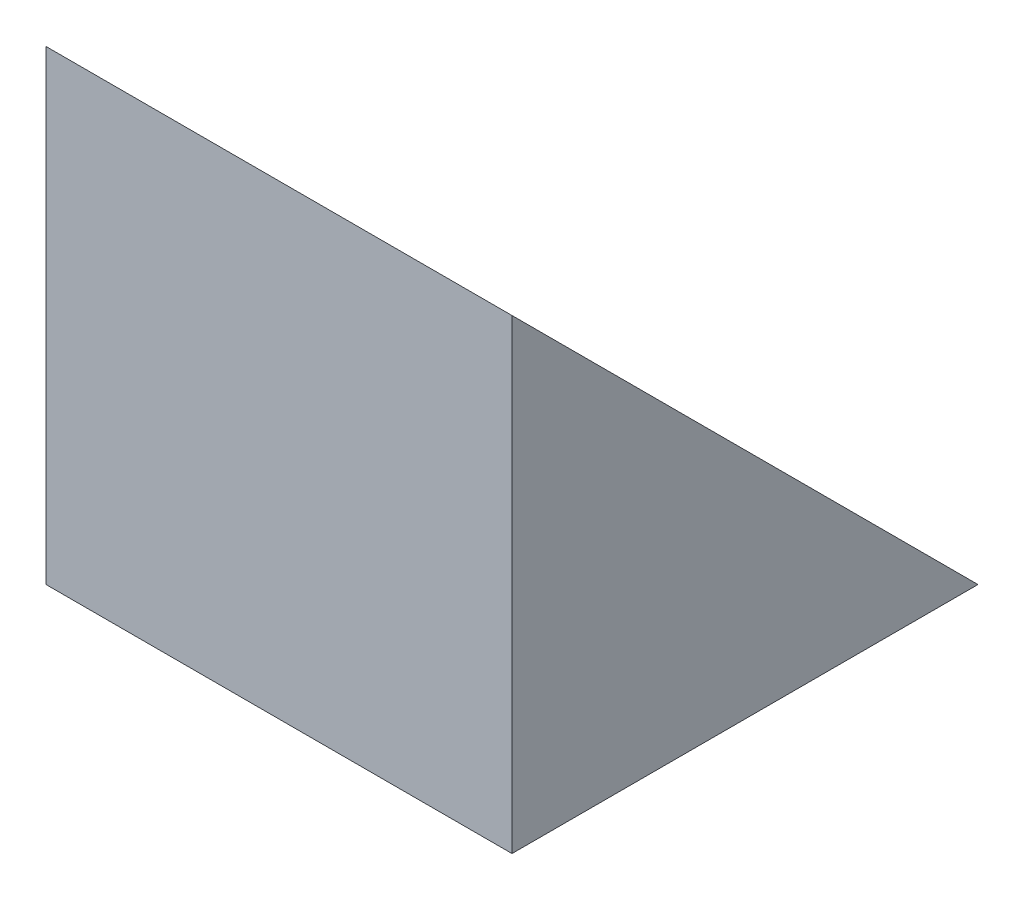
ISO-10303-21;
HEADER;
FILE_DESCRIPTION(('STEP AP214'),'2;1');
FILE_NAME('part.step','',(''),(''),'','','');
FILE_SCHEMA(('AUTOMOTIVE_DESIGN { 1 0 10303 214 1 1 1 1 }'));
ENDSEC;
DATA;
#1=APPLICATION_CONTEXT('core data for automotive mechanical design processes');
#2=APPLICATION_PROTOCOL_DEFINITION('international standard','automotive_design',2000,#1);
#3=PRODUCT_CONTEXT('',#1,'mechanical');
#4=PRODUCT('Part','Part','',(#3));
#5=PRODUCT_RELATED_PRODUCT_CATEGORY('part','',(#4));
#6=PRODUCT_DEFINITION_FORMATION('','',#4);
#7=PRODUCT_DEFINITION_CONTEXT('part definition',#1,'design');
#8=PRODUCT_DEFINITION('design','',#6,#7);
#9=PRODUCT_DEFINITION_SHAPE('','',#8);
#10=(LENGTH_UNIT() NAMED_UNIT(*) SI_UNIT(.MILLI.,.METRE.));
#11=(NAMED_UNIT(*) PLANE_ANGLE_UNIT() SI_UNIT($,.RADIAN.));
#12=(NAMED_UNIT(*) SI_UNIT($,.STERADIAN.) SOLID_ANGLE_UNIT());
#13=UNCERTAINTY_MEASURE_WITH_UNIT(LENGTH_MEASURE(1.E-05),#10,'distance_accuracy_value','');
#14=(GEOMETRIC_REPRESENTATION_CONTEXT(3) GLOBAL_UNCERTAINTY_ASSIGNED_CONTEXT((#13)) GLOBAL_UNIT_ASSIGNED_CONTEXT((#10,
#11,#12)) REPRESENTATION_CONTEXT('',''));
#15=CARTESIAN_POINT('',(0.,0.,0.));
#16=DIRECTION('',(0.,0.,1.));
#17=DIRECTION('',(1.,0.,0.));
#18=AXIS2_PLACEMENT_3D('',#15,#16,#17);
#19=CARTESIAN_POINT('',(40.,40.,0.));
#20=DIRECTION('',(0.,-0.707106781186548,0.707106781186548));
#21=DIRECTION('',(0.,-0.707106781186548,-0.707106781186548));
#22=AXIS2_PLACEMENT_3D('',#19,#20,#21);
#23=PLANE('',#22);
#24=DIRECTION('',(0.,0.707106781186548,0.707106781186548));
#25=VECTOR('',#24,1.);
#26=CARTESIAN_POINT('',(0.,40.,0.));
#27=LINE('',#26,#25);
#28=CARTESIAN_POINT('',(0.,0.,-40.));
#29=VERTEX_POINT('',#28);
#30=CARTESIAN_POINT('',(0.,40.,0.));
#31=VERTEX_POINT('',#30);
#32=EDGE_CURVE('E128',#29,#31,#27,.T.);
#33=ORIENTED_EDGE('',*,*,#32,.T.);
#34=DIRECTION('',(-1.,0.,0.));
#35=VECTOR('',#34,1.);
#36=CARTESIAN_POINT('',(40.,40.,0.));
#37=LINE('',#36,#35);
#38=CARTESIAN_POINT('',(40.,40.,0.));
#39=VERTEX_POINT('',#38);
#40=EDGE_CURVE('E147',#39,#31,#37,.T.);
#41=ORIENTED_EDGE('',*,*,#40,.F.);
#42=DIRECTION('',(0.,0.707106781186548,0.707106781186548));
#43=VECTOR('',#42,1.);
#44=CARTESIAN_POINT('',(40.,40.,0.));
#45=LINE('',#44,#43);
#46=CARTESIAN_POINT('',(40.,0.,-40.));
#47=VERTEX_POINT('',#46);
#48=EDGE_CURVE('E86',#47,#39,#45,.T.);
#49=ORIENTED_EDGE('',*,*,#48,.F.);
#50=DIRECTION('',(-1.,0.,0.));
#51=VECTOR('',#50,1.);
#52=CARTESIAN_POINT('',(40.,0.,-40.));
#53=LINE('',#52,#51);
#54=EDGE_CURVE('E150',#47,#29,#53,.T.);
#55=ORIENTED_EDGE('',*,*,#54,.T.);
#56=EDGE_LOOP('',(#33,#41,#49,#55));
#57=FACE_BOUND('',#56,.T.);
#58=DIRECTION('',(0.,0.707106781186548,0.707106781186548));
#59=VECTOR('',#58,1.);
#60=CARTESIAN_POINT('',(2.,40.,0.));
#61=LINE('',#60,#59);
#62=CARTESIAN_POINT('',(2.,2.,-38.));
#63=VERTEX_POINT('',#62);
#64=CARTESIAN_POINT('',(2.,36.,-4.));
#65=VERTEX_POINT('',#64);
#66=EDGE_CURVE('E11',#63,#65,#61,.T.);
#67=ORIENTED_EDGE('',*,*,#66,.F.);
#68=DIRECTION('',(-1.,0.,0.));
#69=VECTOR('',#68,1.);
#70=CARTESIAN_POINT('',(40.,2.,-38.));
#71=LINE('',#70,#69);
#72=CARTESIAN_POINT('',(38.,2.,-38.));
#73=VERTEX_POINT('',#72);
#74=EDGE_CURVE('E48',#73,#63,#71,.T.);
#75=ORIENTED_EDGE('',*,*,#74,.F.);
#76=DIRECTION('',(0.,-0.707106781186548,-0.707106781186548));
#77=VECTOR('',#76,1.);
#78=CARTESIAN_POINT('',(38.,40.,0.));
#79=LINE('',#78,#77);
#80=CARTESIAN_POINT('',(38.,36.,-4.));
#81=VERTEX_POINT('',#80);
#82=EDGE_CURVE('E156',#81,#73,#79,.T.);
#83=ORIENTED_EDGE('',*,*,#82,.F.);
#84=DIRECTION('',(1.,0.,0.));
#85=VECTOR('',#84,1.);
#86=CARTESIAN_POINT('',(40.,36.,-4.));
#87=LINE('',#86,#85);
#88=EDGE_CURVE('E153',#65,#81,#87,.T.);
#89=ORIENTED_EDGE('',*,*,#88,.F.);
#90=EDGE_LOOP('',(#67,#75,#83,#89));
#91=FACE_BOUND('',#90,.T.);
#92=ADVANCED_FACE('F39',(#57,#91),#23,.F.);
#93=CARTESIAN_POINT('',(40.,0.,-40.));
#94=DIRECTION('',(0.,1.,0.));
#95=DIRECTION('',(0.,0.,1.));
#96=AXIS2_PLACEMENT_3D('',#93,#94,#95);
#97=PLANE('',#96);
#98=CARTESIAN_POINT('',(20.,0.,-21.));
#99=DIRECTION('',(0.,1.,0.));
#100=DIRECTION('',(0.,0.,1.));
#101=AXIS2_PLACEMENT_3D('',#98,#99,#100);
#102=CIRCLE('',#101,3.);
#103=CARTESIAN_POINT('',(20.,0.,-18.));
#104=VERTEX_POINT('',#103);
#105=EDGE_CURVE('E108',#104,#104,#102,.F.);
#106=ORIENTED_EDGE('',*,*,#105,.F.);
#107=EDGE_LOOP('',(#106));
#108=FACE_BOUND('',#107,.T.);
#109=DIRECTION('',(0.,0.,-1.));
#110=VECTOR('',#109,1.);
#111=CARTESIAN_POINT('',(0.,0.,-40.));
#112=LINE('',#111,#110);
#113=CARTESIAN_POINT('',(0.,0.,0.));
#114=VERTEX_POINT('',#113);
#115=EDGE_CURVE('E122',#114,#29,#112,.T.);
#116=ORIENTED_EDGE('',*,*,#115,.T.);
#117=ORIENTED_EDGE('',*,*,#54,.F.);
#118=DIRECTION('',(0.,0.,-1.));
#119=VECTOR('',#118,1.);
#120=CARTESIAN_POINT('',(40.,0.,-40.));
#121=LINE('',#120,#119);
#122=CARTESIAN_POINT('',(40.,0.,0.));
#123=VERTEX_POINT('',#122);
#124=EDGE_CURVE('E133',#123,#47,#121,.T.);
#125=ORIENTED_EDGE('',*,*,#124,.F.);
#126=DIRECTION('',(-1.,0.,0.));
#127=VECTOR('',#126,1.);
#128=CARTESIAN_POINT('',(40.,0.,0.));
#129=LINE('',#128,#127);
#130=EDGE_CURVE('E139',#123,#114,#129,.T.);
#131=ORIENTED_EDGE('',*,*,#130,.T.);
#132=EDGE_LOOP('',(#116,#117,#125,#131));
#133=FACE_BOUND('',#132,.T.);
#134=ADVANCED_FACE('F41',(#108,#133),#97,.F.);
#135=CARTESIAN_POINT('',(40.,0.,0.));
#136=DIRECTION('',(0.,0.,-1.));
#137=DIRECTION('',(-1.,0.,0.));
#138=AXIS2_PLACEMENT_3D('',#135,#136,#137);
#139=PLANE('',#138);
#140=DIRECTION('',(0.,-1.,0.));
#141=VECTOR('',#140,1.);
#142=CARTESIAN_POINT('',(0.,0.,0.));
#143=LINE('',#142,#141);
#144=EDGE_CURVE('E80',#31,#114,#143,.T.);
#145=ORIENTED_EDGE('',*,*,#144,.T.);
#146=ORIENTED_EDGE('',*,*,#130,.F.);
#147=DIRECTION('',(0.,-1.,0.));
#148=VECTOR('',#147,1.);
#149=CARTESIAN_POINT('',(40.,0.,0.));
#150=LINE('',#149,#148);
#151=EDGE_CURVE('E63',#39,#123,#150,.T.);
#152=ORIENTED_EDGE('',*,*,#151,.F.);
#153=ORIENTED_EDGE('',*,*,#40,.T.);
#154=EDGE_LOOP('',(#145,#146,#152,#153));
#155=FACE_BOUND('',#154,.T.);
#156=ADVANCED_FACE('F167',(#155),#139,.F.);
#157=CARTESIAN_POINT('',(40.,0.,0.));
#158=DIRECTION('',(-1.,0.,0.));
#159=DIRECTION('',(0.,0.,1.));
#160=AXIS2_PLACEMENT_3D('',#157,#158,#159);
#161=PLANE('',#160);
#162=ORIENTED_EDGE('',*,*,#124,.T.);
#163=ORIENTED_EDGE('',*,*,#48,.T.);
#164=ORIENTED_EDGE('',*,*,#151,.T.);
#165=EDGE_LOOP('',(#162,#163,#164));
#166=FACE_BOUND('',#165,.T.);
#167=ADVANCED_FACE('F172',(#166),#161,.F.);
#168=CARTESIAN_POINT('',(0.,0.,0.));
#169=DIRECTION('',(-1.,0.,0.));
#170=DIRECTION('',(0.,0.,1.));
#171=AXIS2_PLACEMENT_3D('',#168,#169,#170);
#172=PLANE('',#171);
#173=ORIENTED_EDGE('',*,*,#115,.F.);
#174=ORIENTED_EDGE('',*,*,#144,.F.);
#175=ORIENTED_EDGE('',*,*,#32,.F.);
#176=EDGE_LOOP('',(#173,#174,#175));
#177=FACE_BOUND('',#176,.T.);
#178=ADVANCED_FACE('F173',(#177),#172,.T.);
#179=CARTESIAN_POINT('',(2.,40.,-4.));
#180=DIRECTION('',(1.,0.,0.));
#181=DIRECTION('',(0.,1.,0.));
#182=AXIS2_PLACEMENT_3D('',#179,#180,#181);
#183=PLANE('',#182);
#184=ORIENTED_EDGE('',*,*,#66,.T.);
#185=DIRECTION('',(0.,-1.,0.));
#186=VECTOR('',#185,1.);
#187=CARTESIAN_POINT('',(2.,40.,-4.));
#188=LINE('',#187,#186);
#189=CARTESIAN_POINT('',(2.,2.,-4.));
#190=VERTEX_POINT('',#189);
#191=EDGE_CURVE('E55',#65,#190,#188,.T.);
#192=ORIENTED_EDGE('',*,*,#191,.T.);
#193=DIRECTION('',(0.,0.,-1.));
#194=VECTOR('',#193,1.);
#195=CARTESIAN_POINT('',(2.,2.,-4.));
#196=LINE('',#195,#194);
#197=EDGE_CURVE('E103',#190,#63,#196,.T.);
#198=ORIENTED_EDGE('',*,*,#197,.T.);
#199=EDGE_LOOP('',(#184,#192,#198));
#200=FACE_BOUND('',#199,.T.);
#201=ADVANCED_FACE('F101',(#200),#183,.T.);
#202=CARTESIAN_POINT('',(38.,2.,-4.));
#203=DIRECTION('',(0.,1.,0.));
#204=DIRECTION('',(0.,0.,1.));
#205=AXIS2_PLACEMENT_3D('',#202,#203,#204);
#206=PLANE('',#205);
#207=CARTESIAN_POINT('',(20.,2.,-21.));
#208=DIRECTION('',(0.,1.,0.));
#209=DIRECTION('',(0.,0.,1.));
#210=AXIS2_PLACEMENT_3D('',#207,#208,#209);
#211=CIRCLE('',#210,3.);
#212=CARTESIAN_POINT('',(20.,2.,-18.));
#213=VERTEX_POINT('',#212);
#214=EDGE_CURVE('E196',#213,#213,#211,.T.);
#215=ORIENTED_EDGE('',*,*,#214,.F.);
#216=EDGE_LOOP('',(#215));
#217=FACE_BOUND('',#216,.T.);
#218=ORIENTED_EDGE('',*,*,#74,.T.);
#219=ORIENTED_EDGE('',*,*,#197,.F.);
#220=DIRECTION('',(1.,0.,0.));
#221=VECTOR('',#220,1.);
#222=CARTESIAN_POINT('',(38.,2.,-4.));
#223=LINE('',#222,#221);
#224=CARTESIAN_POINT('',(38.,2.,-4.));
#225=VERTEX_POINT('',#224);
#226=EDGE_CURVE('E107',#190,#225,#223,.T.);
#227=ORIENTED_EDGE('',*,*,#226,.T.);
#228=DIRECTION('',(0.,0.,-1.));
#229=VECTOR('',#228,1.);
#230=CARTESIAN_POINT('',(38.,2.,-4.));
#231=LINE('',#230,#229);
#232=EDGE_CURVE('E123',#225,#73,#231,.T.);
#233=ORIENTED_EDGE('',*,*,#232,.T.);
#234=EDGE_LOOP('',(#218,#219,#227,#233));
#235=FACE_BOUND('',#234,.T.);
#236=ADVANCED_FACE('F119',(#217,#235),#206,.T.);
#237=CARTESIAN_POINT('',(38.,40.,-4.));
#238=DIRECTION('',(-1.,0.,0.));
#239=DIRECTION('',(0.,0.,1.));
#240=AXIS2_PLACEMENT_3D('',#237,#238,#239);
#241=PLANE('',#240);
#242=ORIENTED_EDGE('',*,*,#82,.T.);
#243=ORIENTED_EDGE('',*,*,#232,.F.);
#244=DIRECTION('',(0.,1.,0.));
#245=VECTOR('',#244,1.);
#246=CARTESIAN_POINT('',(38.,40.,-4.));
#247=LINE('',#246,#245);
#248=EDGE_CURVE('E113',#225,#81,#247,.T.);
#249=ORIENTED_EDGE('',*,*,#248,.T.);
#250=EDGE_LOOP('',(#242,#243,#249));
#251=FACE_BOUND('',#250,.T.);
#252=ADVANCED_FACE('F161',(#251),#241,.T.);
#253=CARTESIAN_POINT('',(0.,0.,-4.));
#254=DIRECTION('',(0.,0.,-1.));
#255=DIRECTION('',(-1.,0.,0.));
#256=AXIS2_PLACEMENT_3D('',#253,#254,#255);
#257=PLANE('',#256);
#258=ORIENTED_EDGE('',*,*,#88,.T.);
#259=ORIENTED_EDGE('',*,*,#248,.F.);
#260=ORIENTED_EDGE('',*,*,#226,.F.);
#261=ORIENTED_EDGE('',*,*,#191,.F.);
#262=EDGE_LOOP('',(#258,#259,#260,#261));
#263=FACE_BOUND('',#262,.T.);
#264=ADVANCED_FACE('F111',(#263),#257,.T.);
#265=CARTESIAN_POINT('',(20.,-0.00100000000000013,-21.));
#266=DIRECTION('',(0.,1.,0.));
#267=DIRECTION('',(0.,0.,1.));
#268=AXIS2_PLACEMENT_3D('',#265,#266,#267);
#269=CYLINDRICAL_SURFACE('',#268,3.);
#270=ORIENTED_EDGE('',*,*,#214,.T.);
#271=EDGE_LOOP('',(#270));
#272=FACE_BOUND('',#271,.T.);
#273=ORIENTED_EDGE('',*,*,#105,.T.);
#274=EDGE_LOOP('',(#273));
#275=FACE_BOUND('',#274,.T.);
#276=ADVANCED_FACE('F188',(#272,#275),#269,.F.);
#277=CLOSED_SHELL('',(#92,#134,#156,#167,#178,#201,#236,#252,#264,#276));
#278=MANIFOLD_SOLID_BREP('B2',#277);
#279=ADVANCED_BREP_SHAPE_REPRESENTATION('',(#18,#278),#14);
#280=SHAPE_DEFINITION_REPRESENTATION(#9,#279);
ENDSEC;
END-ISO-10303-21;
